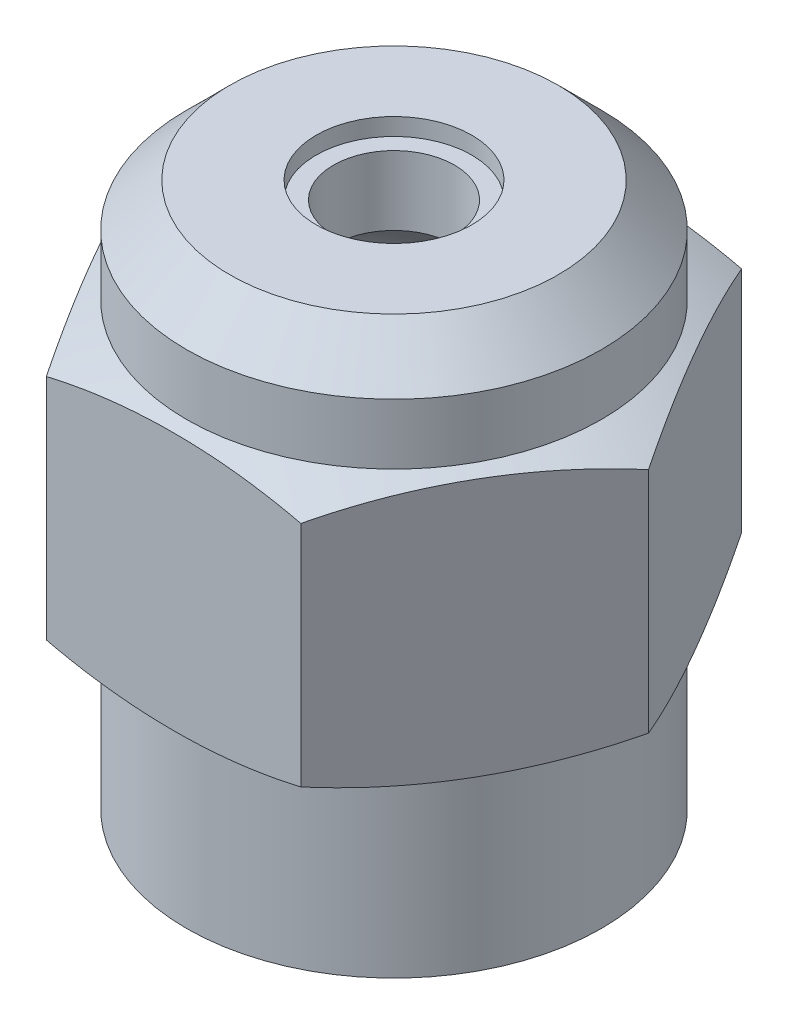
ISO-10303-21;
HEADER;
FILE_DESCRIPTION(('STEP AP214'),'2;1');
FILE_NAME('part.step','',(''),(''),'','','');
FILE_SCHEMA(('AUTOMOTIVE_DESIGN { 1 0 10303 214 1 1 1 1 }'));
ENDSEC;
DATA;
#1=APPLICATION_CONTEXT('core data for automotive mechanical design processes');
#2=APPLICATION_PROTOCOL_DEFINITION('international standard','automotive_design',2000,#1);
#3=PRODUCT_CONTEXT('',#1,'mechanical');
#4=PRODUCT('Part','Part','',(#3));
#5=PRODUCT_RELATED_PRODUCT_CATEGORY('part','',(#4));
#6=PRODUCT_DEFINITION_FORMATION('','',#4);
#7=PRODUCT_DEFINITION_CONTEXT('part definition',#1,'design');
#8=PRODUCT_DEFINITION('design','',#6,#7);
#9=PRODUCT_DEFINITION_SHAPE('','',#8);
#10=(LENGTH_UNIT() NAMED_UNIT(*) SI_UNIT(.MILLI.,.METRE.));
#11=(NAMED_UNIT(*) PLANE_ANGLE_UNIT() SI_UNIT($,.RADIAN.));
#12=(NAMED_UNIT(*) SI_UNIT($,.STERADIAN.) SOLID_ANGLE_UNIT());
#13=UNCERTAINTY_MEASURE_WITH_UNIT(LENGTH_MEASURE(1.E-05),#10,'distance_accuracy_value','');
#14=(GEOMETRIC_REPRESENTATION_CONTEXT(3) GLOBAL_UNCERTAINTY_ASSIGNED_CONTEXT((#13)) GLOBAL_UNIT_ASSIGNED_CONTEXT((#10,
#11,#12)) REPRESENTATION_CONTEXT('',''));
#15=CARTESIAN_POINT('',(0.,0.,0.));
#16=DIRECTION('',(0.,0.,1.));
#17=DIRECTION('',(1.,0.,0.));
#18=AXIS2_PLACEMENT_3D('',#15,#16,#17);
#19=CARTESIAN_POINT('',(0.,0.,0.));
#20=DIRECTION('',(0.,-1.,0.));
#21=DIRECTION('',(0.,0.,-1.));
#22=AXIS2_PLACEMENT_3D('',#19,#20,#21);
#23=CYLINDRICAL_SURFACE('',#22,6.096);
#24=CARTESIAN_POINT('',(0.,0.,0.));
#25=DIRECTION('',(0.,-1.,0.));
#26=DIRECTION('',(0.,0.,-1.));
#27=AXIS2_PLACEMENT_3D('',#24,#25,#26);
#28=CIRCLE('',#27,6.096);
#29=CARTESIAN_POINT('',(0.,0.,-6.096));
#30=VERTEX_POINT('',#29);
#31=EDGE_CURVE('E11',#30,#30,#28,.T.);
#32=ORIENTED_EDGE('',*,*,#31,.F.);
#33=EDGE_LOOP('',(#32));
#34=FACE_BOUND('',#33,.T.);
#35=CARTESIAN_POINT('',(0.,5.08,0.));
#36=DIRECTION('',(0.,-1.,0.));
#37=DIRECTION('',(0.,0.,-1.));
#38=AXIS2_PLACEMENT_3D('',#35,#36,#37);
#39=CIRCLE('',#38,6.096);
#40=CARTESIAN_POINT('',(0.,5.08,-6.096));
#41=VERTEX_POINT('',#40);
#42=EDGE_CURVE('E175',#41,#41,#39,.T.);
#43=ORIENTED_EDGE('',*,*,#42,.T.);
#44=EDGE_LOOP('',(#43));
#45=FACE_BOUND('',#44,.T.);
#46=ADVANCED_FACE('F43',(#34,#45),#23,.T.);
#47=CARTESIAN_POINT('',(6.096,0.,0.));
#48=DIRECTION('',(0.,1.,0.));
#49=DIRECTION('',(0.,0.,1.));
#50=AXIS2_PLACEMENT_3D('',#47,#48,#49);
#51=PLANE('',#50);
#52=CARTESIAN_POINT('',(0.,0.,0.));
#53=DIRECTION('',(0.,-1.,0.));
#54=DIRECTION('',(0.,0.,-1.));
#55=AXIS2_PLACEMENT_3D('',#52,#53,#54);
#56=CIRCLE('',#55,4.191);
#57=CARTESIAN_POINT('',(0.,0.,-4.191));
#58=VERTEX_POINT('',#57);
#59=EDGE_CURVE('E121',#58,#58,#56,.T.);
#60=ORIENTED_EDGE('',*,*,#59,.F.);
#61=EDGE_LOOP('',(#60));
#62=FACE_BOUND('',#61,.T.);
#63=ORIENTED_EDGE('',*,*,#31,.T.);
#64=EDGE_LOOP('',(#63));
#65=FACE_BOUND('',#64,.T.);
#66=ADVANCED_FACE('F45',(#62,#65),#51,.F.);
#67=CARTESIAN_POINT('',(0.,12.954,0.));
#68=DIRECTION('',(0.,-1.,0.));
#69=DIRECTION('',(0.,0.,-1.));
#70=AXIS2_PLACEMENT_3D('',#67,#68,#69);
#71=CIRCLE('',#70,6.096);
#72=CARTESIAN_POINT('',(0.,12.954,-6.096));
#73=VERTEX_POINT('',#72);
#74=EDGE_CURVE('E184',#73,#73,#71,.T.);
#75=ORIENTED_EDGE('',*,*,#74,.F.);
#76=EDGE_LOOP('',(#75));
#77=FACE_BOUND('',#76,.T.);
#78=CARTESIAN_POINT('',(0.,14.732,0.));
#79=DIRECTION('',(0.,-1.,0.));
#80=DIRECTION('',(0.,0.,-1.));
#81=AXIS2_PLACEMENT_3D('',#78,#79,#80);
#82=CIRCLE('',#81,6.096);
#83=CARTESIAN_POINT('',(0.,14.732,-6.096));
#84=VERTEX_POINT('',#83);
#85=EDGE_CURVE('E51',#84,#84,#82,.T.);
#86=ORIENTED_EDGE('',*,*,#85,.T.);
#87=EDGE_LOOP('',(#86));
#88=FACE_BOUND('',#87,.T.);
#89=ADVANCED_FACE('F149',(#77,#88),#23,.T.);
#90=CARTESIAN_POINT('',(0.,14.732,0.));
#91=DIRECTION('',(0.,-1.,0.));
#92=DIRECTION('',(0.,0.,-1.));
#93=AXIS2_PLACEMENT_3D('',#90,#91,#92);
#94=CONICAL_SURFACE('',#93,6.096,0.785398163397448);
#95=CARTESIAN_POINT('',(0.,16.002,0.));
#96=DIRECTION('',(0.,-1.,0.));
#97=DIRECTION('',(0.,0.,-1.));
#98=AXIS2_PLACEMENT_3D('',#95,#96,#97);
#99=CIRCLE('',#98,4.826);
#100=CARTESIAN_POINT('',(0.,16.002,-4.826));
#101=VERTEX_POINT('',#100);
#102=EDGE_CURVE('E144',#101,#101,#99,.T.);
#103=ORIENTED_EDGE('',*,*,#102,.T.);
#104=EDGE_LOOP('',(#103));
#105=FACE_BOUND('',#104,.T.);
#106=ORIENTED_EDGE('',*,*,#85,.F.);
#107=EDGE_LOOP('',(#106));
#108=FACE_BOUND('',#107,.T.);
#109=ADVANCED_FACE('F151',(#105,#108),#94,.T.);
#110=CARTESIAN_POINT('',(4.826,16.002,0.));
#111=DIRECTION('',(0.,1.,0.));
#112=DIRECTION('',(0.,0.,1.));
#113=AXIS2_PLACEMENT_3D('',#110,#111,#112);
#114=PLANE('',#113);
#115=CARTESIAN_POINT('',(0.,16.002,0.));
#116=DIRECTION('',(0.,-1.,0.));
#117=DIRECTION('',(0.,0.,-1.));
#118=AXIS2_PLACEMENT_3D('',#115,#116,#117);
#119=CIRCLE('',#118,2.286);
#120=CARTESIAN_POINT('',(0.,16.002,-2.286));
#121=VERTEX_POINT('',#120);
#122=EDGE_CURVE('E141',#121,#121,#119,.T.);
#123=ORIENTED_EDGE('',*,*,#122,.T.);
#124=EDGE_LOOP('',(#123));
#125=FACE_BOUND('',#124,.T.);
#126=ORIENTED_EDGE('',*,*,#102,.F.);
#127=EDGE_LOOP('',(#126));
#128=FACE_BOUND('',#127,.T.);
#129=ADVANCED_FACE('F153',(#125,#128),#114,.T.);
#130=CARTESIAN_POINT('',(0.,0.,0.));
#131=DIRECTION('',(0.,-1.,0.));
#132=DIRECTION('',(0.,0.,-1.));
#133=AXIS2_PLACEMENT_3D('',#130,#131,#132);
#134=CYLINDRICAL_SURFACE('',#133,2.286);
#135=ORIENTED_EDGE('',*,*,#122,.F.);
#136=EDGE_LOOP('',(#135));
#137=FACE_BOUND('',#136,.T.);
#138=CARTESIAN_POINT('',(0.,15.494,0.));
#139=DIRECTION('',(0.,-1.,0.));
#140=DIRECTION('',(0.,0.,-1.));
#141=AXIS2_PLACEMENT_3D('',#138,#139,#140);
#142=CIRCLE('',#141,2.286);
#143=CARTESIAN_POINT('',(0.,15.494,-2.286));
#144=VERTEX_POINT('',#143);
#145=EDGE_CURVE('E138',#144,#144,#142,.T.);
#146=ORIENTED_EDGE('',*,*,#145,.T.);
#147=EDGE_LOOP('',(#146));
#148=FACE_BOUND('',#147,.T.);
#149=ADVANCED_FACE('F160',(#137,#148),#134,.F.);
#150=CARTESIAN_POINT('',(1.778,15.494,0.));
#151=DIRECTION('',(0.,-1.,0.));
#152=DIRECTION('',(0.,0.,-1.));
#153=AXIS2_PLACEMENT_3D('',#150,#151,#152);
#154=PLANE('',#153);
#155=ORIENTED_EDGE('',*,*,#145,.F.);
#156=EDGE_LOOP('',(#155));
#157=FACE_BOUND('',#156,.T.);
#158=CARTESIAN_POINT('',(0.,15.494,0.));
#159=DIRECTION('',(0.,-1.,0.));
#160=DIRECTION('',(0.,0.,-1.));
#161=AXIS2_PLACEMENT_3D('',#158,#159,#160);
#162=CIRCLE('',#161,1.778);
#163=CARTESIAN_POINT('',(0.,15.494,-1.778));
#164=VERTEX_POINT('',#163);
#165=EDGE_CURVE('E135',#164,#164,#162,.T.);
#166=ORIENTED_EDGE('',*,*,#165,.T.);
#167=EDGE_LOOP('',(#166));
#168=FACE_BOUND('',#167,.T.);
#169=ADVANCED_FACE('F240',(#157,#168),#154,.F.);
#170=CARTESIAN_POINT('',(0.,0.,0.));
#171=DIRECTION('',(0.,-1.,0.));
#172=DIRECTION('',(0.,0.,-1.));
#173=AXIS2_PLACEMENT_3D('',#170,#171,#172);
#174=CYLINDRICAL_SURFACE('',#173,1.778);
#175=CARTESIAN_POINT('',(0.,13.462,0.));
#176=DIRECTION('',(0.,-1.,0.));
#177=DIRECTION('',(0.,0.,-1.));
#178=AXIS2_PLACEMENT_3D('',#175,#176,#177);
#179=CIRCLE('',#178,1.778);
#180=CARTESIAN_POINT('',(0.,13.462,-1.778));
#181=VERTEX_POINT('',#180);
#182=EDGE_CURVE('E132',#181,#181,#179,.T.);
#183=ORIENTED_EDGE('',*,*,#182,.T.);
#184=EDGE_LOOP('',(#183));
#185=FACE_BOUND('',#184,.T.);
#186=ORIENTED_EDGE('',*,*,#165,.F.);
#187=EDGE_LOOP('',(#186));
#188=FACE_BOUND('',#187,.T.);
#189=ADVANCED_FACE('F236',(#185,#188),#174,.F.);
#190=CARTESIAN_POINT('',(0.,9.66684558943908,0.));
#191=DIRECTION('',(0.,-1.,0.));
#192=DIRECTION('',(1.,0.,0.));
#193=AXIS2_PLACEMENT_3D('',#190,#191,#192);
#194=SPHERICAL_SURFACE('',#193,4.191);
#195=ORIENTED_EDGE('',*,*,#182,.F.);
#196=EDGE_LOOP('',(#195));
#197=FACE_BOUND('',#196,.T.);
#198=CARTESIAN_POINT('',(0.,9.66684558943908,0.));
#199=DIRECTION('',(0.,-1.,0.));
#200=DIRECTION('',(0.,0.,-1.));
#201=AXIS2_PLACEMENT_3D('',#198,#199,#200);
#202=CIRCLE('',#201,4.191);
#203=CARTESIAN_POINT('',(0.,9.66684558943908,-4.191));
#204=VERTEX_POINT('',#203);
#205=EDGE_CURVE('E129',#204,#204,#202,.T.);
#206=ORIENTED_EDGE('',*,*,#205,.T.);
#207=EDGE_LOOP('',(#206));
#208=FACE_BOUND('',#207,.T.);
#209=ADVANCED_FACE('F232',(#197,#208),#194,.F.);
#210=CARTESIAN_POINT('',(0.,0.,0.));
#211=DIRECTION('',(0.,-1.,0.));
#212=DIRECTION('',(0.,0.,-1.));
#213=AXIS2_PLACEMENT_3D('',#210,#211,#212);
#214=CYLINDRICAL_SURFACE('',#213,4.191);
#215=ORIENTED_EDGE('',*,*,#205,.F.);
#216=EDGE_LOOP('',(#215));
#217=FACE_BOUND('',#216,.T.);
#218=ORIENTED_EDGE('',*,*,#59,.T.);
#219=EDGE_LOOP('',(#218));
#220=FACE_BOUND('',#219,.T.);
#221=ADVANCED_FACE('F230',(#217,#220),#214,.F.);
#222=CARTESIAN_POINT('',(-7.47899538708241,5.08,0.));
#223=DIRECTION('',(0.866025403784439,0.,0.5));
#224=DIRECTION('',(0.5,0.,-0.866025403784438));
#225=AXIS2_PLACEMENT_3D('',#222,#223,#224);
#226=PLANE('',#225);
#227=DIRECTION('',(0.,1.,0.));
#228=VECTOR('',#227,1.);
#229=CARTESIAN_POINT('',(-3.7394976935412,5.08,-6.477));
#230=LINE('',#229,#228);
#231=CARTESIAN_POINT('',(-3.7394976935412,5.6642,-6.477));
#232=VERTEX_POINT('',#231);
#233=CARTESIAN_POINT('',(-3.7394976935412,12.3698,-6.477));
#234=VERTEX_POINT('',#233);
#235=EDGE_CURVE('E119',#232,#234,#230,.T.);
#236=ORIENTED_EDGE('',*,*,#235,.F.);
#237=CARTESIAN_POINT('',(-5.60924654031181,21.4403608695652,-3.2385));
#238=DIRECTION('',(0.866025403784439,0.,0.5));
#239=DIRECTION('',(0.5,0.,-0.866025403784438));
#240=AXIS2_PLACEMENT_3D('',#237,#238,#239);
#241=CIRCLE('',#240,16.213299935004);
#242=CARTESIAN_POINT('',(-7.47899538708241,5.6642,0.));
#243=VERTEX_POINT('',#242);
#244=EDGE_CURVE('E101',#232,#243,#241,.F.);
#245=ORIENTED_EDGE('',*,*,#244,.T.);
#246=DIRECTION('',(0.,1.,0.));
#247=VECTOR('',#246,1.);
#248=CARTESIAN_POINT('',(-7.47899538708241,5.08,0.));
#249=LINE('',#248,#247);
#250=CARTESIAN_POINT('',(-7.47899538708241,12.3698,0.));
#251=VERTEX_POINT('',#250);
#252=EDGE_CURVE('E66',#243,#251,#249,.T.);
#253=ORIENTED_EDGE('',*,*,#252,.T.);
#254=CARTESIAN_POINT('',(-5.60924654031181,-3.40636086956523,-3.2385));
#255=DIRECTION('',(0.866025403784439,0.,0.5));
#256=DIRECTION('',(0.5,0.,-0.866025403784438));
#257=AXIS2_PLACEMENT_3D('',#254,#255,#256);
#258=CIRCLE('',#257,16.213299935004);
#259=EDGE_CURVE('E199',#251,#234,#258,.F.);
#260=ORIENTED_EDGE('',*,*,#259,.T.);
#261=EDGE_LOOP('',(#236,#245,#253,#260));
#262=FACE_BOUND('',#261,.T.);
#263=ADVANCED_FACE('F227',(#262),#226,.F.);
#264=CARTESIAN_POINT('',(-3.7394976935412,5.08,-6.477));
#265=DIRECTION('',(0.,0.,1.));
#266=DIRECTION('',(1.,0.,0.));
#267=AXIS2_PLACEMENT_3D('',#264,#265,#266);
#268=PLANE('',#267);
#269=DIRECTION('',(0.,1.,0.));
#270=VECTOR('',#269,1.);
#271=CARTESIAN_POINT('',(3.73949769354121,5.08,-6.477));
#272=LINE('',#271,#270);
#273=CARTESIAN_POINT('',(3.73949769354121,5.6642,-6.477));
#274=VERTEX_POINT('',#273);
#275=CARTESIAN_POINT('',(3.73949769354121,12.3698,-6.477));
#276=VERTEX_POINT('',#275);
#277=EDGE_CURVE('E110',#274,#276,#272,.T.);
#278=ORIENTED_EDGE('',*,*,#277,.F.);
#279=CARTESIAN_POINT('',(0.,21.4403608695652,-6.477));
#280=DIRECTION('',(0.,0.,1.));
#281=DIRECTION('',(1.,0.,0.));
#282=AXIS2_PLACEMENT_3D('',#279,#280,#281);
#283=CIRCLE('',#282,16.213299935004);
#284=EDGE_CURVE('E96',#274,#232,#283,.F.);
#285=ORIENTED_EDGE('',*,*,#284,.T.);
#286=ORIENTED_EDGE('',*,*,#235,.T.);
#287=CARTESIAN_POINT('',(0.,-3.40636086956523,-6.477));
#288=DIRECTION('',(0.,0.,1.));
#289=DIRECTION('',(1.,0.,0.));
#290=AXIS2_PLACEMENT_3D('',#287,#288,#289);
#291=CIRCLE('',#290,16.213299935004);
#292=EDGE_CURVE('E118',#234,#276,#291,.F.);
#293=ORIENTED_EDGE('',*,*,#292,.T.);
#294=EDGE_LOOP('',(#278,#285,#286,#293));
#295=FACE_BOUND('',#294,.T.);
#296=ADVANCED_FACE('F116',(#295),#268,.F.);
#297=CARTESIAN_POINT('',(3.73949769354121,5.08,-6.477));
#298=DIRECTION('',(-0.866025403784439,0.,0.5));
#299=DIRECTION('',(0.5,0.,0.866025403784439));
#300=AXIS2_PLACEMENT_3D('',#297,#298,#299);
#301=PLANE('',#300);
#302=DIRECTION('',(0.,1.,0.));
#303=VECTOR('',#302,1.);
#304=CARTESIAN_POINT('',(7.47899538708241,5.08,0.));
#305=LINE('',#304,#303);
#306=CARTESIAN_POINT('',(7.47899538708241,5.6642,0.));
#307=VERTEX_POINT('',#306);
#308=CARTESIAN_POINT('',(7.47899538708241,12.3698,0.));
#309=VERTEX_POINT('',#308);
#310=EDGE_CURVE('E112',#307,#309,#305,.T.);
#311=ORIENTED_EDGE('',*,*,#310,.F.);
#312=CARTESIAN_POINT('',(5.60924654031181,21.4403608695652,-3.2385));
#313=DIRECTION('',(-0.866025403784439,0.,0.5));
#314=DIRECTION('',(0.5,0.,0.866025403784439));
#315=AXIS2_PLACEMENT_3D('',#312,#313,#314);
#316=CIRCLE('',#315,16.213299935004);
#317=EDGE_CURVE('E99',#307,#274,#316,.F.);
#318=ORIENTED_EDGE('',*,*,#317,.T.);
#319=ORIENTED_EDGE('',*,*,#277,.T.);
#320=CARTESIAN_POINT('',(5.60924654031181,-3.40636086956523,-3.2385));
#321=DIRECTION('',(-0.866025403784439,0.,0.5));
#322=DIRECTION('',(0.5,0.,0.866025403784439));
#323=AXIS2_PLACEMENT_3D('',#320,#321,#322);
#324=CIRCLE('',#323,16.213299935004);
#325=EDGE_CURVE('E196',#276,#309,#324,.F.);
#326=ORIENTED_EDGE('',*,*,#325,.T.);
#327=EDGE_LOOP('',(#311,#318,#319,#326));
#328=FACE_BOUND('',#327,.T.);
#329=ADVANCED_FACE('F108',(#328),#301,.F.);
#330=CARTESIAN_POINT('',(7.47899538708241,5.08,0.));
#331=DIRECTION('',(-0.866025403784439,0.,-0.5));
#332=DIRECTION('',(-0.5,0.,0.866025403784439));
#333=AXIS2_PLACEMENT_3D('',#330,#331,#332);
#334=PLANE('',#333);
#335=DIRECTION('',(0.,1.,0.));
#336=VECTOR('',#335,1.);
#337=CARTESIAN_POINT('',(3.73949769354121,5.08,6.477));
#338=LINE('',#337,#336);
#339=CARTESIAN_POINT('',(3.73949769354121,5.6642,6.477));
#340=VERTEX_POINT('',#339);
#341=CARTESIAN_POINT('',(3.73949769354121,12.3698,6.477));
#342=VERTEX_POINT('',#341);
#343=EDGE_CURVE('E123',#340,#342,#338,.T.);
#344=ORIENTED_EDGE('',*,*,#343,.F.);
#345=CARTESIAN_POINT('',(5.60924654031181,21.4403608695652,3.2385));
#346=DIRECTION('',(-0.866025403784439,0.,-0.5));
#347=DIRECTION('',(-0.5,0.,0.866025403784439));
#348=AXIS2_PLACEMENT_3D('',#345,#346,#347);
#349=CIRCLE('',#348,16.213299935004);
#350=EDGE_CURVE('E113',#340,#307,#349,.F.);
#351=ORIENTED_EDGE('',*,*,#350,.T.);
#352=ORIENTED_EDGE('',*,*,#310,.T.);
#353=CARTESIAN_POINT('',(5.60924654031181,-3.40636086956523,3.2385));
#354=DIRECTION('',(-0.866025403784439,0.,-0.5));
#355=DIRECTION('',(-0.5,0.,0.866025403784439));
#356=AXIS2_PLACEMENT_3D('',#353,#354,#355);
#357=CIRCLE('',#356,16.213299935004);
#358=EDGE_CURVE('E193',#309,#342,#357,.F.);
#359=ORIENTED_EDGE('',*,*,#358,.T.);
#360=EDGE_LOOP('',(#344,#351,#352,#359));
#361=FACE_BOUND('',#360,.T.);
#362=ADVANCED_FACE('F213',(#361),#334,.F.);
#363=CARTESIAN_POINT('',(3.73949769354121,5.08,6.477));
#364=DIRECTION('',(0.,0.,-1.));
#365=DIRECTION('',(-1.,0.,0.));
#366=AXIS2_PLACEMENT_3D('',#363,#364,#365);
#367=PLANE('',#366);
#368=DIRECTION('',(0.,1.,0.));
#369=VECTOR('',#368,1.);
#370=CARTESIAN_POINT('',(-3.73949769354121,5.08,6.477));
#371=LINE('',#370,#369);
#372=CARTESIAN_POINT('',(-3.73949769354121,5.6642,6.477));
#373=VERTEX_POINT('',#372);
#374=CARTESIAN_POINT('',(-3.73949769354121,12.3698,6.477));
#375=VERTEX_POINT('',#374);
#376=EDGE_CURVE('E202',#373,#375,#371,.T.);
#377=ORIENTED_EDGE('',*,*,#376,.F.);
#378=CARTESIAN_POINT('',(0.,21.4403608695652,6.477));
#379=DIRECTION('',(0.,0.,-1.));
#380=DIRECTION('',(-1.,0.,0.));
#381=AXIS2_PLACEMENT_3D('',#378,#379,#380);
#382=CIRCLE('',#381,16.213299935004);
#383=EDGE_CURVE('E58',#373,#340,#382,.F.);
#384=ORIENTED_EDGE('',*,*,#383,.T.);
#385=ORIENTED_EDGE('',*,*,#343,.T.);
#386=CARTESIAN_POINT('',(0.,-3.40636086956523,6.477));
#387=DIRECTION('',(0.,0.,-1.));
#388=DIRECTION('',(-1.,0.,0.));
#389=AXIS2_PLACEMENT_3D('',#386,#387,#388);
#390=CIRCLE('',#389,16.213299935004);
#391=EDGE_CURVE('E190',#342,#375,#390,.F.);
#392=ORIENTED_EDGE('',*,*,#391,.T.);
#393=EDGE_LOOP('',(#377,#384,#385,#392));
#394=FACE_BOUND('',#393,.T.);
#395=ADVANCED_FACE('F207',(#394),#367,.F.);
#396=CARTESIAN_POINT('',(-3.73949769354121,5.08,6.477));
#397=DIRECTION('',(0.866025403784439,0.,-0.5));
#398=DIRECTION('',(-0.5,0.,-0.866025403784438));
#399=AXIS2_PLACEMENT_3D('',#396,#397,#398);
#400=PLANE('',#399);
#401=ORIENTED_EDGE('',*,*,#252,.F.);
#402=CARTESIAN_POINT('',(-5.60924654031181,21.4403608695652,3.2385));
#403=DIRECTION('',(0.866025403784439,0.,-0.5));
#404=DIRECTION('',(-0.5,0.,-0.866025403784438));
#405=AXIS2_PLACEMENT_3D('',#402,#403,#404);
#406=CIRCLE('',#405,16.213299935004);
#407=EDGE_CURVE('E177',#243,#373,#406,.F.);
#408=ORIENTED_EDGE('',*,*,#407,.T.);
#409=ORIENTED_EDGE('',*,*,#376,.T.);
#410=CARTESIAN_POINT('',(-5.60924654031181,-3.40636086956523,3.2385));
#411=DIRECTION('',(0.866025403784439,0.,-0.5));
#412=DIRECTION('',(-0.5,0.,-0.866025403784438));
#413=AXIS2_PLACEMENT_3D('',#410,#411,#412);
#414=CIRCLE('',#413,16.213299935004);
#415=EDGE_CURVE('E187',#375,#251,#414,.F.);
#416=ORIENTED_EDGE('',*,*,#415,.T.);
#417=EDGE_LOOP('',(#401,#408,#409,#416));
#418=FACE_BOUND('',#417,.T.);
#419=ADVANCED_FACE('F220',(#418),#400,.F.);
#420=CARTESIAN_POINT('',(0.,-3.40636086956523,0.));
#421=DIRECTION('',(0.,-1.,0.));
#422=DIRECTION('',(1.,0.,0.));
#423=AXIS2_PLACEMENT_3D('',#420,#421,#422);
#424=SPHERICAL_SURFACE('',#423,17.4591701916901);
#425=ORIENTED_EDGE('',*,*,#74,.T.);
#426=EDGE_LOOP('',(#425));
#427=FACE_BOUND('',#426,.T.);
#428=ORIENTED_EDGE('',*,*,#415,.F.);
#429=ORIENTED_EDGE('',*,*,#391,.F.);
#430=ORIENTED_EDGE('',*,*,#358,.F.);
#431=ORIENTED_EDGE('',*,*,#325,.F.);
#432=ORIENTED_EDGE('',*,*,#292,.F.);
#433=ORIENTED_EDGE('',*,*,#259,.F.);
#434=EDGE_LOOP('',(#428,#429,#430,#431,#432,#433));
#435=FACE_BOUND('',#434,.T.);
#436=ADVANCED_FACE('F212',(#427,#435),#424,.T.);
#437=CARTESIAN_POINT('',(0.,21.4403608695652,0.));
#438=DIRECTION('',(0.,1.,0.));
#439=DIRECTION('',(1.,0.,0.));
#440=AXIS2_PLACEMENT_3D('',#437,#438,#439);
#441=SPHERICAL_SURFACE('',#440,17.4591701916901);
#442=ORIENTED_EDGE('',*,*,#42,.F.);
#443=EDGE_LOOP('',(#442));
#444=FACE_BOUND('',#443,.T.);
#445=ORIENTED_EDGE('',*,*,#284,.F.);
#446=ORIENTED_EDGE('',*,*,#317,.F.);
#447=ORIENTED_EDGE('',*,*,#350,.F.);
#448=ORIENTED_EDGE('',*,*,#383,.F.);
#449=ORIENTED_EDGE('',*,*,#407,.F.);
#450=ORIENTED_EDGE('',*,*,#244,.F.);
#451=EDGE_LOOP('',(#445,#446,#447,#448,#449,#450));
#452=FACE_BOUND('',#451,.T.);
#453=ADVANCED_FACE('F98',(#444,#452),#441,.T.);
#454=CLOSED_SHELL('',(#46,#66,#89,#109,#129,#149,#169,#189,#209,#221,#263,#296,#329,#362,#395,
#419,#436,#453));
#455=MANIFOLD_SOLID_BREP('B2',#454);
#456=ADVANCED_BREP_SHAPE_REPRESENTATION('',(#18,#455),#14);
#457=SHAPE_DEFINITION_REPRESENTATION(#9,#456);
ENDSEC;
END-ISO-10303-21;
